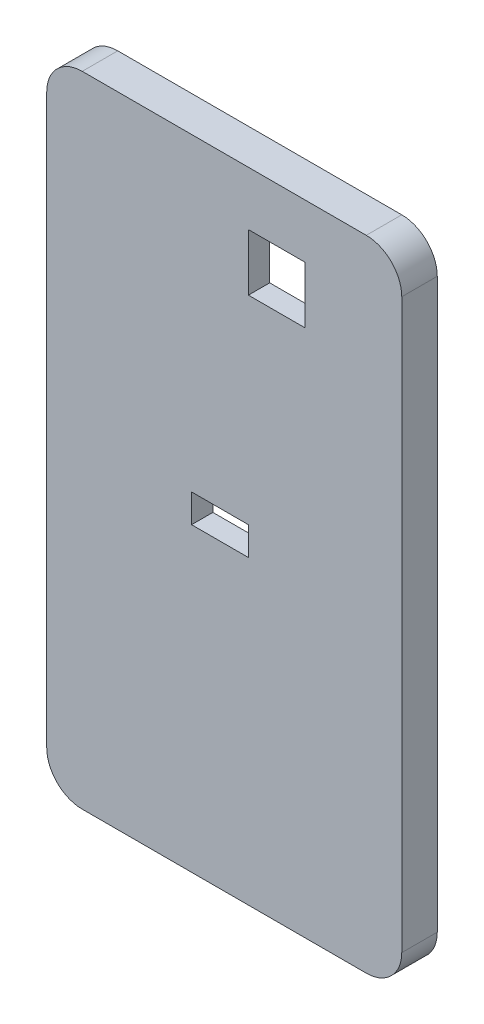
ISO-10303-21;
HEADER;
FILE_DESCRIPTION(('STEP AP214'),'2;1');
FILE_NAME('part.step','',(''),(''),'','','');
FILE_SCHEMA(('AUTOMOTIVE_DESIGN { 1 0 10303 214 1 1 1 1 }'));
ENDSEC;
DATA;
#1=APPLICATION_CONTEXT('core data for automotive mechanical design processes');
#2=APPLICATION_PROTOCOL_DEFINITION('international standard','automotive_design',2000,#1);
#3=PRODUCT_CONTEXT('',#1,'mechanical');
#4=PRODUCT('Part','Part','',(#3));
#5=PRODUCT_RELATED_PRODUCT_CATEGORY('part','',(#4));
#6=PRODUCT_DEFINITION_FORMATION('','',#4);
#7=PRODUCT_DEFINITION_CONTEXT('part definition',#1,'design');
#8=PRODUCT_DEFINITION('design','',#6,#7);
#9=PRODUCT_DEFINITION_SHAPE('','',#8);
#10=(LENGTH_UNIT() NAMED_UNIT(*) SI_UNIT(.MILLI.,.METRE.));
#11=(NAMED_UNIT(*) PLANE_ANGLE_UNIT() SI_UNIT($,.RADIAN.));
#12=(NAMED_UNIT(*) SI_UNIT($,.STERADIAN.) SOLID_ANGLE_UNIT());
#13=UNCERTAINTY_MEASURE_WITH_UNIT(LENGTH_MEASURE(1.E-05),#10,'distance_accuracy_value','');
#14=(GEOMETRIC_REPRESENTATION_CONTEXT(3) GLOBAL_UNCERTAINTY_ASSIGNED_CONTEXT((#13)) GLOBAL_UNIT_ASSIGNED_CONTEXT((#10,
#11,#12)) REPRESENTATION_CONTEXT('',''));
#15=CARTESIAN_POINT('',(0.,0.,0.));
#16=DIRECTION('',(0.,0.,1.));
#17=DIRECTION('',(1.,0.,0.));
#18=AXIS2_PLACEMENT_3D('',#15,#16,#17);
#19=CARTESIAN_POINT('',(0.,0.,6.35));
#20=DIRECTION('',(1.,0.,0.));
#21=DIRECTION('',(0.,1.,0.));
#22=AXIS2_PLACEMENT_3D('',#19,#20,#21);
#23=PLANE('',#22);
#24=DIRECTION('',(0.,-1.,0.));
#25=VECTOR('',#24,1.);
#26=CARTESIAN_POINT('',(0.,0.,6.35));
#27=LINE('',#26,#25);
#28=CARTESIAN_POINT('',(0.,-6.35,6.35));
#29=VERTEX_POINT('',#28);
#30=CARTESIAN_POINT('',(0.,-107.95,6.35));
#31=VERTEX_POINT('',#30);
#32=EDGE_CURVE('E325',#29,#31,#27,.T.);
#33=ORIENTED_EDGE('',*,*,#32,.F.);
#34=DIRECTION('',(0.,0.,-1.));
#35=VECTOR('',#34,1.);
#36=CARTESIAN_POINT('',(0.,-6.35,6.35));
#37=LINE('',#36,#35);
#38=CARTESIAN_POINT('',(0.,-6.35,0.));
#39=VERTEX_POINT('',#38);
#40=EDGE_CURVE('E11',#29,#39,#37,.T.);
#41=ORIENTED_EDGE('',*,*,#40,.T.);
#42=DIRECTION('',(0.,-1.,0.));
#43=VECTOR('',#42,1.);
#44=CARTESIAN_POINT('',(0.,0.,0.));
#45=LINE('',#44,#43);
#46=CARTESIAN_POINT('',(0.,-107.95,0.));
#47=VERTEX_POINT('',#46);
#48=EDGE_CURVE('E310',#39,#47,#45,.T.);
#49=ORIENTED_EDGE('',*,*,#48,.T.);
#50=DIRECTION('',(0.,0.,-1.));
#51=VECTOR('',#50,1.);
#52=CARTESIAN_POINT('',(0.,-107.95,6.35));
#53=LINE('',#52,#51);
#54=EDGE_CURVE('E41',#47,#31,#53,.F.);
#55=ORIENTED_EDGE('',*,*,#54,.T.);
#56=EDGE_LOOP('',(#33,#41,#49,#55));
#57=FACE_BOUND('',#56,.T.);
#58=ADVANCED_FACE('F33',(#57),#23,.F.);
#59=CARTESIAN_POINT('',(0.,-114.3,6.35));
#60=DIRECTION('',(0.,1.,0.));
#61=DIRECTION('',(0.,0.,1.));
#62=AXIS2_PLACEMENT_3D('',#59,#60,#61);
#63=PLANE('',#62);
#64=DIRECTION('',(1.,0.,0.));
#65=VECTOR('',#64,1.);
#66=CARTESIAN_POINT('',(0.,-114.3,0.));
#67=LINE('',#66,#65);
#68=CARTESIAN_POINT('',(6.35000000000001,-114.3,0.));
#69=VERTEX_POINT('',#68);
#70=CARTESIAN_POINT('',(57.15,-114.3,0.));
#71=VERTEX_POINT('',#70);
#72=EDGE_CURVE('E341',#69,#71,#67,.T.);
#73=ORIENTED_EDGE('',*,*,#72,.T.);
#74=DIRECTION('',(0.,0.,-1.));
#75=VECTOR('',#74,1.);
#76=CARTESIAN_POINT('',(57.15,-114.3,6.35));
#77=LINE('',#76,#75);
#78=CARTESIAN_POINT('',(57.15,-114.3,6.35));
#79=VERTEX_POINT('',#78);
#80=EDGE_CURVE('E377',#71,#79,#77,.F.);
#81=ORIENTED_EDGE('',*,*,#80,.T.);
#82=DIRECTION('',(1.,0.,0.));
#83=VECTOR('',#82,1.);
#84=CARTESIAN_POINT('',(0.,-114.3,6.35));
#85=LINE('',#84,#83);
#86=CARTESIAN_POINT('',(6.35000000000001,-114.3,6.35));
#87=VERTEX_POINT('',#86);
#88=EDGE_CURVE('E328',#87,#79,#85,.T.);
#89=ORIENTED_EDGE('',*,*,#88,.F.);
#90=DIRECTION('',(0.,0.,-1.));
#91=VECTOR('',#90,1.);
#92=CARTESIAN_POINT('',(6.35000000000001,-114.3,6.35));
#93=LINE('',#92,#91);
#94=EDGE_CURVE('E374',#87,#69,#93,.T.);
#95=ORIENTED_EDGE('',*,*,#94,.T.);
#96=EDGE_LOOP('',(#73,#81,#89,#95));
#97=FACE_BOUND('',#96,.T.);
#98=ADVANCED_FACE('F391',(#97),#63,.F.);
#99=CARTESIAN_POINT('',(63.5,0.,6.35));
#100=DIRECTION('',(-1.,0.,0.));
#101=DIRECTION('',(0.,-1.,0.));
#102=AXIS2_PLACEMENT_3D('',#99,#100,#101);
#103=PLANE('',#102);
#104=DIRECTION('',(0.,1.,0.));
#105=VECTOR('',#104,1.);
#106=CARTESIAN_POINT('',(63.5,0.,0.));
#107=LINE('',#106,#105);
#108=CARTESIAN_POINT('',(63.5,-107.95,0.));
#109=VERTEX_POINT('',#108);
#110=CARTESIAN_POINT('',(63.5,-6.35,0.));
#111=VERTEX_POINT('',#110);
#112=EDGE_CURVE('E344',#109,#111,#107,.T.);
#113=ORIENTED_EDGE('',*,*,#112,.T.);
#114=DIRECTION('',(0.,0.,-1.));
#115=VECTOR('',#114,1.);
#116=CARTESIAN_POINT('',(63.5,-6.35,6.35));
#117=LINE('',#116,#115);
#118=CARTESIAN_POINT('',(63.5,-6.35,6.35));
#119=VERTEX_POINT('',#118);
#120=EDGE_CURVE('E364',#111,#119,#117,.F.);
#121=ORIENTED_EDGE('',*,*,#120,.T.);
#122=DIRECTION('',(0.,1.,0.));
#123=VECTOR('',#122,1.);
#124=CARTESIAN_POINT('',(63.5,0.,6.35));
#125=LINE('',#124,#123);
#126=CARTESIAN_POINT('',(63.5,-107.95,6.35));
#127=VERTEX_POINT('',#126);
#128=EDGE_CURVE('E332',#127,#119,#125,.T.);
#129=ORIENTED_EDGE('',*,*,#128,.F.);
#130=DIRECTION('',(0.,0.,-1.));
#131=VECTOR('',#130,1.);
#132=CARTESIAN_POINT('',(63.5,-107.95,6.35));
#133=LINE('',#132,#131);
#134=EDGE_CURVE('E361',#127,#109,#133,.T.);
#135=ORIENTED_EDGE('',*,*,#134,.T.);
#136=EDGE_LOOP('',(#113,#121,#129,#135));
#137=FACE_BOUND('',#136,.T.);
#138=ADVANCED_FACE('F403',(#137),#103,.F.);
#139=CARTESIAN_POINT('',(0.,0.,6.35));
#140=DIRECTION('',(0.,-1.,0.));
#141=DIRECTION('',(0.,0.,-1.));
#142=AXIS2_PLACEMENT_3D('',#139,#140,#141);
#143=PLANE('',#142);
#144=DIRECTION('',(-1.,0.,0.));
#145=VECTOR('',#144,1.);
#146=CARTESIAN_POINT('',(0.,0.,6.35));
#147=LINE('',#146,#145);
#148=CARTESIAN_POINT('',(57.15,0.,6.35));
#149=VERTEX_POINT('',#148);
#150=CARTESIAN_POINT('',(6.35,0.,6.35));
#151=VERTEX_POINT('',#150);
#152=EDGE_CURVE('E335',#149,#151,#147,.T.);
#153=ORIENTED_EDGE('',*,*,#152,.F.);
#154=DIRECTION('',(0.,0.,-1.));
#155=VECTOR('',#154,1.);
#156=CARTESIAN_POINT('',(57.15,0.,6.35));
#157=LINE('',#156,#155);
#158=CARTESIAN_POINT('',(57.15,0.,0.));
#159=VERTEX_POINT('',#158);
#160=EDGE_CURVE('E350',#149,#159,#157,.T.);
#161=ORIENTED_EDGE('',*,*,#160,.T.);
#162=DIRECTION('',(-1.,0.,0.));
#163=VECTOR('',#162,1.);
#164=CARTESIAN_POINT('',(0.,0.,0.));
#165=LINE('',#164,#163);
#166=CARTESIAN_POINT('',(6.35,0.,0.));
#167=VERTEX_POINT('',#166);
#168=EDGE_CURVE('E329',#159,#167,#165,.T.);
#169=ORIENTED_EDGE('',*,*,#168,.T.);
#170=DIRECTION('',(0.,0.,-1.));
#171=VECTOR('',#170,1.);
#172=CARTESIAN_POINT('',(6.35,0.,6.35));
#173=LINE('',#172,#171);
#174=EDGE_CURVE('E338',#167,#151,#173,.F.);
#175=ORIENTED_EDGE('',*,*,#174,.T.);
#176=EDGE_LOOP('',(#153,#161,#169,#175));
#177=FACE_BOUND('',#176,.T.);
#178=ADVANCED_FACE('F411',(#177),#143,.F.);
#179=CARTESIAN_POINT('',(0.,0.,6.35));
#180=DIRECTION('',(0.,0.,1.));
#181=DIRECTION('',(1.,0.,0.));
#182=AXIS2_PLACEMENT_3D('',#179,#180,#181);
#183=PLANE('',#182);
#184=DIRECTION('',(-1.,0.,0.));
#185=VECTOR('',#184,1.);
#186=CARTESIAN_POINT('',(0.,-60.452,6.35));
#187=LINE('',#186,#185);
#188=CARTESIAN_POINT('',(36.068,-60.452,6.35));
#189=VERTEX_POINT('',#188);
#190=CARTESIAN_POINT('',(25.908,-60.452,6.35));
#191=VERTEX_POINT('',#190);
#192=EDGE_CURVE('E196',#189,#191,#187,.T.);
#193=ORIENTED_EDGE('',*,*,#192,.T.);
#194=DIRECTION('',(0.,1.,0.));
#195=VECTOR('',#194,1.);
#196=CARTESIAN_POINT('',(25.908,0.,6.35));
#197=LINE('',#196,#195);
#198=CARTESIAN_POINT('',(25.908,-55.372,6.35));
#199=VERTEX_POINT('',#198);
#200=EDGE_CURVE('E202',#191,#199,#197,.T.);
#201=ORIENTED_EDGE('',*,*,#200,.T.);
#202=DIRECTION('',(-1.,0.,0.));
#203=VECTOR('',#202,1.);
#204=CARTESIAN_POINT('',(0.,-55.372,6.35));
#205=LINE('',#204,#203);
#206=CARTESIAN_POINT('',(36.068,-55.372,6.35));
#207=VERTEX_POINT('',#206);
#208=EDGE_CURVE('E206',#207,#199,#205,.T.);
#209=ORIENTED_EDGE('',*,*,#208,.F.);
#210=DIRECTION('',(0.,1.,0.));
#211=VECTOR('',#210,1.);
#212=CARTESIAN_POINT('',(36.068,0.,6.35));
#213=LINE('',#212,#211);
#214=EDGE_CURVE('E199',#189,#207,#213,.T.);
#215=ORIENTED_EDGE('',*,*,#214,.F.);
#216=EDGE_LOOP('',(#193,#201,#209,#215));
#217=FACE_BOUND('',#216,.T.);
#218=DIRECTION('',(0.,-1.,0.));
#219=VECTOR('',#218,1.);
#220=CARTESIAN_POINT('',(46.228,-9.652,6.35));
#221=LINE('',#220,#219);
#222=CARTESIAN_POINT('',(46.228,-9.652,6.35));
#223=VERTEX_POINT('',#222);
#224=CARTESIAN_POINT('',(46.228,-19.812,6.35));
#225=VERTEX_POINT('',#224);
#226=EDGE_CURVE('E229',#223,#225,#221,.T.);
#227=ORIENTED_EDGE('',*,*,#226,.T.);
#228=DIRECTION('',(-1.,0.,0.));
#229=VECTOR('',#228,1.);
#230=CARTESIAN_POINT('',(46.228,-19.812,6.35));
#231=LINE('',#230,#229);
#232=CARTESIAN_POINT('',(36.068,-19.812,6.35));
#233=VERTEX_POINT('',#232);
#234=EDGE_CURVE('E232',#225,#233,#231,.T.);
#235=ORIENTED_EDGE('',*,*,#234,.T.);
#236=DIRECTION('',(0.,1.,0.));
#237=VECTOR('',#236,1.);
#238=CARTESIAN_POINT('',(36.068,-9.652,6.35));
#239=LINE('',#238,#237);
#240=CARTESIAN_POINT('',(36.068,-9.652,6.35));
#241=VERTEX_POINT('',#240);
#242=EDGE_CURVE('E236',#233,#241,#239,.T.);
#243=ORIENTED_EDGE('',*,*,#242,.T.);
#244=DIRECTION('',(1.,0.,0.));
#245=VECTOR('',#244,1.);
#246=CARTESIAN_POINT('',(46.228,-9.652,6.35));
#247=LINE('',#246,#245);
#248=EDGE_CURVE('E239',#241,#223,#247,.T.);
#249=ORIENTED_EDGE('',*,*,#248,.T.);
#250=EDGE_LOOP('',(#227,#235,#243,#249));
#251=FACE_BOUND('',#250,.T.);
#252=ORIENTED_EDGE('',*,*,#128,.T.);
#253=CARTESIAN_POINT('',(57.15,-6.35,6.35));
#254=DIRECTION('',(0.,0.,1.));
#255=DIRECTION('',(1.,0.,0.));
#256=AXIS2_PLACEMENT_3D('',#253,#254,#255);
#257=CIRCLE('',#256,6.35);
#258=EDGE_CURVE('E372',#119,#149,#257,.T.);
#259=ORIENTED_EDGE('',*,*,#258,.T.);
#260=ORIENTED_EDGE('',*,*,#152,.T.);
#261=CARTESIAN_POINT('',(6.35,-6.35,6.35));
#262=DIRECTION('',(0.,0.,1.));
#263=DIRECTION('',(1.,0.,0.));
#264=AXIS2_PLACEMENT_3D('',#261,#262,#263);
#265=CIRCLE('',#264,6.35);
#266=EDGE_CURVE('E368',#151,#29,#265,.T.);
#267=ORIENTED_EDGE('',*,*,#266,.T.);
#268=ORIENTED_EDGE('',*,*,#32,.T.);
#269=CARTESIAN_POINT('',(6.35000000000001,-107.95,6.35));
#270=DIRECTION('',(0.,0.,1.));
#271=DIRECTION('',(1.,0.,0.));
#272=AXIS2_PLACEMENT_3D('',#269,#270,#271);
#273=CIRCLE('',#272,6.35);
#274=EDGE_CURVE('E366',#31,#87,#273,.T.);
#275=ORIENTED_EDGE('',*,*,#274,.T.);
#276=ORIENTED_EDGE('',*,*,#88,.T.);
#277=CARTESIAN_POINT('',(57.15,-107.95,6.35));
#278=DIRECTION('',(0.,0.,1.));
#279=DIRECTION('',(1.,0.,0.));
#280=AXIS2_PLACEMENT_3D('',#277,#278,#279);
#281=CIRCLE('',#280,6.35);
#282=EDGE_CURVE('E370',#79,#127,#281,.T.);
#283=ORIENTED_EDGE('',*,*,#282,.T.);
#284=EDGE_LOOP('',(#252,#259,#260,#267,#268,#275,#276,#283));
#285=FACE_BOUND('',#284,.T.);
#286=ADVANCED_FACE('F208',(#217,#251,#285),#183,.T.);
#287=CARTESIAN_POINT('',(0.,0.,0.));
#288=DIRECTION('',(0.,0.,1.));
#289=DIRECTION('',(1.,0.,0.));
#290=AXIS2_PLACEMENT_3D('',#287,#288,#289);
#291=PLANE('',#290);
#292=DIRECTION('',(0.,-1.,0.));
#293=VECTOR('',#292,1.);
#294=CARTESIAN_POINT('',(60.96,-6.45365241608726,0.));
#295=LINE('',#294,#293);
#296=CARTESIAN_POINT('',(60.96,-6.45365241608726,0.));
#297=VERTEX_POINT('',#296);
#298=CARTESIAN_POINT('',(60.96,-107.95,0.));
#299=VERTEX_POINT('',#298);
#300=EDGE_CURVE('E288',#297,#299,#295,.T.);
#301=ORIENTED_EDGE('',*,*,#300,.F.);
#302=CARTESIAN_POINT('',(57.151410218659,-6.34999973901355,0.));
#303=DIRECTION('',(0.,0.,-1.));
#304=DIRECTION('',(1.,0.,0.));
#305=AXIS2_PLACEMENT_3D('',#302,#303,#304);
#306=CIRCLE('',#305,3.81);
#307=CARTESIAN_POINT('',(57.15,-2.54,0.));
#308=VERTEX_POINT('',#307);
#309=EDGE_CURVE('E254',#308,#297,#306,.T.);
#310=ORIENTED_EDGE('',*,*,#309,.F.);
#311=DIRECTION('',(1.,0.,0.));
#312=VECTOR('',#311,1.);
#313=CARTESIAN_POINT('',(57.15,-2.54,0.));
#314=LINE('',#313,#312);
#315=CARTESIAN_POINT('',(6.35,-2.54,0.));
#316=VERTEX_POINT('',#315);
#317=EDGE_CURVE('E265',#316,#308,#314,.T.);
#318=ORIENTED_EDGE('',*,*,#317,.F.);
#319=CARTESIAN_POINT('',(6.34999999999942,-6.34999999999942,0.));
#320=DIRECTION('',(0.,0.,-1.));
#321=DIRECTION('',(1.,0.,0.));
#322=AXIS2_PLACEMENT_3D('',#319,#320,#321);
#323=CIRCLE('',#322,3.80999999999941);
#324=CARTESIAN_POINT('',(2.54,-6.35,0.));
#325=VERTEX_POINT('',#324);
#326=EDGE_CURVE('E303',#325,#316,#323,.T.);
#327=ORIENTED_EDGE('',*,*,#326,.F.);
#328=DIRECTION('',(0.,1.,0.));
#329=VECTOR('',#328,1.);
#330=CARTESIAN_POINT('',(2.54,-6.35,0.));
#331=LINE('',#330,#329);
#332=CARTESIAN_POINT('',(2.53999999999999,-107.95,0.));
#333=VERTEX_POINT('',#332);
#334=EDGE_CURVE('E300',#333,#325,#331,.T.);
#335=ORIENTED_EDGE('',*,*,#334,.F.);
#336=CARTESIAN_POINT('',(6.35000000000006,-107.95,0.));
#337=DIRECTION('',(0.,0.,-1.));
#338=DIRECTION('',(1.,0.,0.));
#339=AXIS2_PLACEMENT_3D('',#336,#337,#338);
#340=CIRCLE('',#339,3.81000000000007);
#341=CARTESIAN_POINT('',(6.35,-111.76,0.));
#342=VERTEX_POINT('',#341);
#343=EDGE_CURVE('E297',#342,#333,#340,.T.);
#344=ORIENTED_EDGE('',*,*,#343,.F.);
#345=DIRECTION('',(-1.,0.,0.));
#346=VECTOR('',#345,1.);
#347=CARTESIAN_POINT('',(6.35,-111.76,0.));
#348=LINE('',#347,#346);
#349=CARTESIAN_POINT('',(57.15,-111.76,0.));
#350=VERTEX_POINT('',#349);
#351=EDGE_CURVE('E294',#350,#342,#348,.T.);
#352=ORIENTED_EDGE('',*,*,#351,.F.);
#353=CARTESIAN_POINT('',(57.1500000000001,-107.95,0.));
#354=DIRECTION('',(0.,0.,-1.));
#355=DIRECTION('',(1.,0.,0.));
#356=AXIS2_PLACEMENT_3D('',#353,#354,#355);
#357=CIRCLE('',#356,3.80999999999991);
#358=EDGE_CURVE('E291',#299,#350,#357,.T.);
#359=ORIENTED_EDGE('',*,*,#358,.F.);
#360=EDGE_LOOP('',(#301,#310,#318,#327,#335,#344,#352,#359));
#361=FACE_BOUND('',#360,.T.);
#362=ORIENTED_EDGE('',*,*,#168,.F.);
#363=CARTESIAN_POINT('',(57.15,-6.35,0.));
#364=DIRECTION('',(0.,0.,1.));
#365=DIRECTION('',(1.,0.,0.));
#366=AXIS2_PLACEMENT_3D('',#363,#364,#365);
#367=CIRCLE('',#366,6.35);
#368=EDGE_CURVE('E359',#159,#111,#367,.F.);
#369=ORIENTED_EDGE('',*,*,#368,.T.);
#370=ORIENTED_EDGE('',*,*,#112,.F.);
#371=CARTESIAN_POINT('',(57.15,-107.95,0.));
#372=DIRECTION('',(0.,0.,1.));
#373=DIRECTION('',(1.,0.,0.));
#374=AXIS2_PLACEMENT_3D('',#371,#372,#373);
#375=CIRCLE('',#374,6.35);
#376=EDGE_CURVE('E357',#109,#71,#375,.F.);
#377=ORIENTED_EDGE('',*,*,#376,.T.);
#378=ORIENTED_EDGE('',*,*,#72,.F.);
#379=CARTESIAN_POINT('',(6.35000000000001,-107.95,0.));
#380=DIRECTION('',(0.,0.,1.));
#381=DIRECTION('',(1.,0.,0.));
#382=AXIS2_PLACEMENT_3D('',#379,#380,#381);
#383=CIRCLE('',#382,6.35);
#384=EDGE_CURVE('E353',#69,#47,#383,.F.);
#385=ORIENTED_EDGE('',*,*,#384,.T.);
#386=ORIENTED_EDGE('',*,*,#48,.F.);
#387=CARTESIAN_POINT('',(6.35,-6.35,0.));
#388=DIRECTION('',(0.,0.,1.));
#389=DIRECTION('',(1.,0.,0.));
#390=AXIS2_PLACEMENT_3D('',#387,#388,#389);
#391=CIRCLE('',#390,6.35);
#392=EDGE_CURVE('E355',#39,#167,#391,.F.);
#393=ORIENTED_EDGE('',*,*,#392,.T.);
#394=EDGE_LOOP('',(#362,#369,#370,#377,#378,#385,#386,#393));
#395=FACE_BOUND('',#394,.T.);
#396=ADVANCED_FACE('F395',(#361,#395),#291,.F.);
#397=CARTESIAN_POINT('',(57.15,-6.35,6.35));
#398=DIRECTION('',(0.,0.,-1.));
#399=DIRECTION('',(-1.,0.,0.));
#400=AXIS2_PLACEMENT_3D('',#397,#398,#399);
#401=CYLINDRICAL_SURFACE('',#400,6.35);
#402=ORIENTED_EDGE('',*,*,#258,.F.);
#403=ORIENTED_EDGE('',*,*,#120,.F.);
#404=ORIENTED_EDGE('',*,*,#368,.F.);
#405=ORIENTED_EDGE('',*,*,#160,.F.);
#406=EDGE_LOOP('',(#402,#403,#404,#405));
#407=FACE_BOUND('',#406,.T.);
#408=ADVANCED_FACE('F409',(#407),#401,.T.);
#409=CARTESIAN_POINT('',(57.15,-107.95,6.35));
#410=DIRECTION('',(0.,0.,-1.));
#411=DIRECTION('',(-1.,0.,0.));
#412=AXIS2_PLACEMENT_3D('',#409,#410,#411);
#413=CYLINDRICAL_SURFACE('',#412,6.35);
#414=ORIENTED_EDGE('',*,*,#282,.F.);
#415=ORIENTED_EDGE('',*,*,#80,.F.);
#416=ORIENTED_EDGE('',*,*,#376,.F.);
#417=ORIENTED_EDGE('',*,*,#134,.F.);
#418=EDGE_LOOP('',(#414,#415,#416,#417));
#419=FACE_BOUND('',#418,.T.);
#420=ADVANCED_FACE('F400',(#419),#413,.T.);
#421=CARTESIAN_POINT('',(6.35,-6.35,6.35));
#422=DIRECTION('',(0.,0.,-1.));
#423=DIRECTION('',(-1.,0.,0.));
#424=AXIS2_PLACEMENT_3D('',#421,#422,#423);
#425=CYLINDRICAL_SURFACE('',#424,6.35);
#426=ORIENTED_EDGE('',*,*,#266,.F.);
#427=ORIENTED_EDGE('',*,*,#174,.F.);
#428=ORIENTED_EDGE('',*,*,#392,.F.);
#429=ORIENTED_EDGE('',*,*,#40,.F.);
#430=EDGE_LOOP('',(#426,#427,#428,#429));
#431=FACE_BOUND('',#430,.T.);
#432=ADVANCED_FACE('F414',(#431),#425,.T.);
#433=CARTESIAN_POINT('',(6.35000000000001,-107.95,6.35));
#434=DIRECTION('',(0.,0.,-1.));
#435=DIRECTION('',(-1.,0.,0.));
#436=AXIS2_PLACEMENT_3D('',#433,#434,#435);
#437=CYLINDRICAL_SURFACE('',#436,6.35);
#438=ORIENTED_EDGE('',*,*,#274,.F.);
#439=ORIENTED_EDGE('',*,*,#54,.F.);
#440=ORIENTED_EDGE('',*,*,#384,.F.);
#441=ORIENTED_EDGE('',*,*,#94,.F.);
#442=EDGE_LOOP('',(#438,#439,#440,#441));
#443=FACE_BOUND('',#442,.T.);
#444=ADVANCED_FACE('F35',(#443),#437,.T.);
#445=CARTESIAN_POINT('',(57.151410218659,-6.34999973901355,2.54));
#446=DIRECTION('',(0.,0.,-1.));
#447=DIRECTION('',(-1.,0.,0.));
#448=AXIS2_PLACEMENT_3D('',#445,#446,#447);
#449=CYLINDRICAL_SURFACE('',#448,3.81);
#450=ORIENTED_EDGE('',*,*,#309,.T.);
#451=DIRECTION('',(0.,0.,-1.));
#452=VECTOR('',#451,1.);
#453=CARTESIAN_POINT('',(60.96,-6.45365241608726,2.54));
#454=LINE('',#453,#452);
#455=CARTESIAN_POINT('',(60.96,-6.45365241608726,2.54));
#456=VERTEX_POINT('',#455);
#457=EDGE_CURVE('E286',#456,#297,#454,.T.);
#458=ORIENTED_EDGE('',*,*,#457,.F.);
#459=CARTESIAN_POINT('',(57.151410218659,-6.34999973901355,2.54));
#460=DIRECTION('',(0.,0.,-1.));
#461=DIRECTION('',(1.,0.,0.));
#462=AXIS2_PLACEMENT_3D('',#459,#460,#461);
#463=CIRCLE('',#462,3.81);
#464=CARTESIAN_POINT('',(57.15,-2.54,2.54));
#465=VERTEX_POINT('',#464);
#466=EDGE_CURVE('E261',#465,#456,#463,.T.);
#467=ORIENTED_EDGE('',*,*,#466,.F.);
#468=DIRECTION('',(0.,0.,-1.));
#469=VECTOR('',#468,1.);
#470=CARTESIAN_POINT('',(57.15,-2.54,2.54));
#471=LINE('',#470,#469);
#472=EDGE_CURVE('E308',#465,#308,#471,.T.);
#473=ORIENTED_EDGE('',*,*,#472,.T.);
#474=EDGE_LOOP('',(#450,#458,#467,#473));
#475=FACE_BOUND('',#474,.T.);
#476=ADVANCED_FACE('F420',(#475),#449,.F.);
#477=CARTESIAN_POINT('',(57.15,-2.54,2.54));
#478=DIRECTION('',(0.,1.,0.));
#479=DIRECTION('',(0.,0.,1.));
#480=AXIS2_PLACEMENT_3D('',#477,#478,#479);
#481=PLANE('',#480);
#482=ORIENTED_EDGE('',*,*,#317,.T.);
#483=ORIENTED_EDGE('',*,*,#472,.F.);
#484=DIRECTION('',(1.,0.,0.));
#485=VECTOR('',#484,1.);
#486=CARTESIAN_POINT('',(57.15,-2.54,2.54));
#487=LINE('',#486,#485);
#488=CARTESIAN_POINT('',(6.35,-2.54,2.54));
#489=VERTEX_POINT('',#488);
#490=EDGE_CURVE('E283',#489,#465,#487,.T.);
#491=ORIENTED_EDGE('',*,*,#490,.F.);
#492=DIRECTION('',(0.,0.,-1.));
#493=VECTOR('',#492,1.);
#494=CARTESIAN_POINT('',(6.35,-2.54,2.54));
#495=LINE('',#494,#493);
#496=EDGE_CURVE('E311',#489,#316,#495,.T.);
#497=ORIENTED_EDGE('',*,*,#496,.T.);
#498=EDGE_LOOP('',(#482,#483,#491,#497));
#499=FACE_BOUND('',#498,.T.);
#500=ADVANCED_FACE('F533',(#499),#481,.F.);
#501=CARTESIAN_POINT('',(6.34999999999942,-6.34999999999942,2.54));
#502=DIRECTION('',(0.,0.,-1.));
#503=DIRECTION('',(-1.,0.,0.));
#504=AXIS2_PLACEMENT_3D('',#501,#502,#503);
#505=CYLINDRICAL_SURFACE('',#504,3.80999999999941);
#506=ORIENTED_EDGE('',*,*,#326,.T.);
#507=ORIENTED_EDGE('',*,*,#496,.F.);
#508=CARTESIAN_POINT('',(6.34999999999942,-6.34999999999942,2.54));
#509=DIRECTION('',(0.,0.,-1.));
#510=DIRECTION('',(1.,0.,0.));
#511=AXIS2_PLACEMENT_3D('',#508,#509,#510);
#512=CIRCLE('',#511,3.80999999999941);
#513=CARTESIAN_POINT('',(2.54,-6.35,2.54));
#514=VERTEX_POINT('',#513);
#515=EDGE_CURVE('E280',#514,#489,#512,.T.);
#516=ORIENTED_EDGE('',*,*,#515,.F.);
#517=DIRECTION('',(0.,0.,-1.));
#518=VECTOR('',#517,1.);
#519=CARTESIAN_POINT('',(2.54,-6.35,2.54));
#520=LINE('',#519,#518);
#521=EDGE_CURVE('E313',#514,#325,#520,.T.);
#522=ORIENTED_EDGE('',*,*,#521,.T.);
#523=EDGE_LOOP('',(#506,#507,#516,#522));
#524=FACE_BOUND('',#523,.T.);
#525=ADVANCED_FACE('F536',(#524),#505,.F.);
#526=CARTESIAN_POINT('',(2.54,-6.35,2.54));
#527=DIRECTION('',(-1.,0.,0.));
#528=DIRECTION('',(0.,-1.,0.));
#529=AXIS2_PLACEMENT_3D('',#526,#527,#528);
#530=PLANE('',#529);
#531=ORIENTED_EDGE('',*,*,#334,.T.);
#532=ORIENTED_EDGE('',*,*,#521,.F.);
#533=DIRECTION('',(0.,1.,0.));
#534=VECTOR('',#533,1.);
#535=CARTESIAN_POINT('',(2.54,-6.35,2.54));
#536=LINE('',#535,#534);
#537=CARTESIAN_POINT('',(2.53999999999999,-107.95,2.54));
#538=VERTEX_POINT('',#537);
#539=EDGE_CURVE('E277',#538,#514,#536,.T.);
#540=ORIENTED_EDGE('',*,*,#539,.F.);
#541=DIRECTION('',(0.,0.,-1.));
#542=VECTOR('',#541,1.);
#543=CARTESIAN_POINT('',(2.53999999999999,-107.95,2.54));
#544=LINE('',#543,#542);
#545=EDGE_CURVE('E315',#538,#333,#544,.T.);
#546=ORIENTED_EDGE('',*,*,#545,.T.);
#547=EDGE_LOOP('',(#531,#532,#540,#546));
#548=FACE_BOUND('',#547,.T.);
#549=ADVANCED_FACE('F540',(#548),#530,.F.);
#550=CARTESIAN_POINT('',(6.35000000000006,-107.95,2.54));
#551=DIRECTION('',(0.,0.,-1.));
#552=DIRECTION('',(-1.,0.,0.));
#553=AXIS2_PLACEMENT_3D('',#550,#551,#552);
#554=CYLINDRICAL_SURFACE('',#553,3.81000000000007);
#555=ORIENTED_EDGE('',*,*,#343,.T.);
#556=ORIENTED_EDGE('',*,*,#545,.F.);
#557=CARTESIAN_POINT('',(6.35000000000006,-107.95,2.54));
#558=DIRECTION('',(0.,0.,-1.));
#559=DIRECTION('',(1.,0.,0.));
#560=AXIS2_PLACEMENT_3D('',#557,#558,#559);
#561=CIRCLE('',#560,3.81000000000007);
#562=CARTESIAN_POINT('',(6.35,-111.76,2.54));
#563=VERTEX_POINT('',#562);
#564=EDGE_CURVE('E274',#563,#538,#561,.T.);
#565=ORIENTED_EDGE('',*,*,#564,.F.);
#566=DIRECTION('',(0.,0.,-1.));
#567=VECTOR('',#566,1.);
#568=CARTESIAN_POINT('',(6.35,-111.76,2.54));
#569=LINE('',#568,#567);
#570=EDGE_CURVE('E317',#563,#342,#569,.T.);
#571=ORIENTED_EDGE('',*,*,#570,.T.);
#572=EDGE_LOOP('',(#555,#556,#565,#571));
#573=FACE_BOUND('',#572,.T.);
#574=ADVANCED_FACE('F544',(#573),#554,.F.);
#575=CARTESIAN_POINT('',(6.35,-111.76,2.54));
#576=DIRECTION('',(0.,-1.,0.));
#577=DIRECTION('',(1.,0.,0.));
#578=AXIS2_PLACEMENT_3D('',#575,#576,#577);
#579=PLANE('',#578);
#580=ORIENTED_EDGE('',*,*,#351,.T.);
#581=ORIENTED_EDGE('',*,*,#570,.F.);
#582=DIRECTION('',(-1.,0.,0.));
#583=VECTOR('',#582,1.);
#584=CARTESIAN_POINT('',(6.35,-111.76,2.54));
#585=LINE('',#584,#583);
#586=CARTESIAN_POINT('',(57.15,-111.76,2.54));
#587=VERTEX_POINT('',#586);
#588=EDGE_CURVE('E271',#587,#563,#585,.T.);
#589=ORIENTED_EDGE('',*,*,#588,.F.);
#590=DIRECTION('',(0.,0.,-1.));
#591=VECTOR('',#590,1.);
#592=CARTESIAN_POINT('',(57.15,-111.76,2.54));
#593=LINE('',#592,#591);
#594=EDGE_CURVE('E319',#587,#350,#593,.T.);
#595=ORIENTED_EDGE('',*,*,#594,.T.);
#596=EDGE_LOOP('',(#580,#581,#589,#595));
#597=FACE_BOUND('',#596,.T.);
#598=ADVANCED_FACE('F548',(#597),#579,.F.);
#599=CARTESIAN_POINT('',(57.1500000000001,-107.95,2.54));
#600=DIRECTION('',(0.,0.,-1.));
#601=DIRECTION('',(-1.,0.,0.));
#602=AXIS2_PLACEMENT_3D('',#599,#600,#601);
#603=CYLINDRICAL_SURFACE('',#602,3.80999999999991);
#604=ORIENTED_EDGE('',*,*,#358,.T.);
#605=ORIENTED_EDGE('',*,*,#594,.F.);
#606=CARTESIAN_POINT('',(57.1500000000001,-107.95,2.54));
#607=DIRECTION('',(0.,0.,-1.));
#608=DIRECTION('',(1.,0.,0.));
#609=AXIS2_PLACEMENT_3D('',#606,#607,#608);
#610=CIRCLE('',#609,3.80999999999991);
#611=CARTESIAN_POINT('',(60.96,-107.95,2.54));
#612=VERTEX_POINT('',#611);
#613=EDGE_CURVE('E268',#612,#587,#610,.T.);
#614=ORIENTED_EDGE('',*,*,#613,.F.);
#615=DIRECTION('',(0.,0.,-1.));
#616=VECTOR('',#615,1.);
#617=CARTESIAN_POINT('',(60.96,-107.95,2.54));
#618=LINE('',#617,#616);
#619=EDGE_CURVE('E321',#612,#299,#618,.T.);
#620=ORIENTED_EDGE('',*,*,#619,.T.);
#621=EDGE_LOOP('',(#604,#605,#614,#620));
#622=FACE_BOUND('',#621,.T.);
#623=ADVANCED_FACE('F552',(#622),#603,.F.);
#624=CARTESIAN_POINT('',(60.96,-6.45365241608726,2.54));
#625=DIRECTION('',(1.,0.,0.));
#626=DIRECTION('',(0.,1.,0.));
#627=AXIS2_PLACEMENT_3D('',#624,#625,#626);
#628=PLANE('',#627);
#629=ORIENTED_EDGE('',*,*,#300,.T.);
#630=ORIENTED_EDGE('',*,*,#619,.F.);
#631=DIRECTION('',(0.,-1.,0.));
#632=VECTOR('',#631,1.);
#633=CARTESIAN_POINT('',(60.96,-6.45365241608726,2.54));
#634=LINE('',#633,#632);
#635=EDGE_CURVE('E264',#456,#612,#634,.T.);
#636=ORIENTED_EDGE('',*,*,#635,.F.);
#637=ORIENTED_EDGE('',*,*,#457,.T.);
#638=EDGE_LOOP('',(#629,#630,#636,#637));
#639=FACE_BOUND('',#638,.T.);
#640=ADVANCED_FACE('F475',(#639),#628,.F.);
#641=CARTESIAN_POINT('',(57.151410218659,-6.34999973901355,2.54));
#642=DIRECTION('',(0.,0.,1.));
#643=DIRECTION('',(1.,0.,0.));
#644=AXIS2_PLACEMENT_3D('',#641,#642,#643);
#645=PLANE('',#644);
#646=DIRECTION('',(0.,1.,0.));
#647=VECTOR('',#646,1.);
#648=CARTESIAN_POINT('',(25.908,0.,2.54));
#649=LINE('',#648,#647);
#650=CARTESIAN_POINT('',(25.908,-60.452,2.54));
#651=VERTEX_POINT('',#650);
#652=CARTESIAN_POINT('',(25.908,-55.372,2.54));
#653=VERTEX_POINT('',#652);
#654=EDGE_CURVE('E219',#651,#653,#649,.T.);
#655=ORIENTED_EDGE('',*,*,#654,.F.);
#656=DIRECTION('',(-1.,0.,0.));
#657=VECTOR('',#656,1.);
#658=CARTESIAN_POINT('',(0.,-60.452,2.54));
#659=LINE('',#658,#657);
#660=CARTESIAN_POINT('',(36.068,-60.452,2.54));
#661=VERTEX_POINT('',#660);
#662=EDGE_CURVE('E56',#661,#651,#659,.T.);
#663=ORIENTED_EDGE('',*,*,#662,.F.);
#664=DIRECTION('',(0.,1.,0.));
#665=VECTOR('',#664,1.);
#666=CARTESIAN_POINT('',(36.068,0.,2.54));
#667=LINE('',#666,#665);
#668=CARTESIAN_POINT('',(36.068,-55.372,2.54));
#669=VERTEX_POINT('',#668);
#670=EDGE_CURVE('E210',#661,#669,#667,.T.);
#671=ORIENTED_EDGE('',*,*,#670,.T.);
#672=DIRECTION('',(-1.,0.,0.));
#673=VECTOR('',#672,1.);
#674=CARTESIAN_POINT('',(0.,-55.372,2.54));
#675=LINE('',#674,#673);
#676=EDGE_CURVE('E213',#669,#653,#675,.T.);
#677=ORIENTED_EDGE('',*,*,#676,.T.);
#678=EDGE_LOOP('',(#655,#663,#671,#677));
#679=FACE_BOUND('',#678,.T.);
#680=DIRECTION('',(-1.,0.,0.));
#681=VECTOR('',#680,1.);
#682=CARTESIAN_POINT('',(46.228,-19.812,2.54));
#683=LINE('',#682,#681);
#684=CARTESIAN_POINT('',(46.228,-19.812,2.54));
#685=VERTEX_POINT('',#684);
#686=CARTESIAN_POINT('',(36.068,-19.812,2.54));
#687=VERTEX_POINT('',#686);
#688=EDGE_CURVE('E244',#685,#687,#683,.T.);
#689=ORIENTED_EDGE('',*,*,#688,.F.);
#690=DIRECTION('',(0.,-1.,0.));
#691=VECTOR('',#690,1.);
#692=CARTESIAN_POINT('',(46.228,-9.652,2.54));
#693=LINE('',#692,#691);
#694=CARTESIAN_POINT('',(46.228,-9.652,2.54));
#695=VERTEX_POINT('',#694);
#696=EDGE_CURVE('E225',#695,#685,#693,.T.);
#697=ORIENTED_EDGE('',*,*,#696,.F.);
#698=DIRECTION('',(1.,0.,0.));
#699=VECTOR('',#698,1.);
#700=CARTESIAN_POINT('',(46.228,-9.652,2.54));
#701=LINE('',#700,#699);
#702=CARTESIAN_POINT('',(36.068,-9.652,2.54));
#703=VERTEX_POINT('',#702);
#704=EDGE_CURVE('E233',#703,#695,#701,.T.);
#705=ORIENTED_EDGE('',*,*,#704,.F.);
#706=DIRECTION('',(0.,1.,0.));
#707=VECTOR('',#706,1.);
#708=CARTESIAN_POINT('',(36.068,-9.652,2.54));
#709=LINE('',#708,#707);
#710=EDGE_CURVE('E247',#687,#703,#709,.T.);
#711=ORIENTED_EDGE('',*,*,#710,.F.);
#712=EDGE_LOOP('',(#689,#697,#705,#711));
#713=FACE_BOUND('',#712,.T.);
#714=ORIENTED_EDGE('',*,*,#466,.T.);
#715=ORIENTED_EDGE('',*,*,#635,.T.);
#716=ORIENTED_EDGE('',*,*,#613,.T.);
#717=ORIENTED_EDGE('',*,*,#588,.T.);
#718=ORIENTED_EDGE('',*,*,#564,.T.);
#719=ORIENTED_EDGE('',*,*,#539,.T.);
#720=ORIENTED_EDGE('',*,*,#515,.T.);
#721=ORIENTED_EDGE('',*,*,#490,.T.);
#722=EDGE_LOOP('',(#714,#715,#716,#717,#718,#719,#720,#721));
#723=FACE_BOUND('',#722,.T.);
#724=ADVANCED_FACE('F469',(#679,#713,#723),#645,.F.);
#725=CARTESIAN_POINT('',(46.228,-9.652,6.35));
#726=DIRECTION('',(1.,0.,0.));
#727=DIRECTION('',(0.,0.,-1.));
#728=AXIS2_PLACEMENT_3D('',#725,#726,#727);
#729=PLANE('',#728);
#730=ORIENTED_EDGE('',*,*,#696,.T.);
#731=DIRECTION('',(0.,0.,-1.));
#732=VECTOR('',#731,1.);
#733=CARTESIAN_POINT('',(46.228,-19.812,6.35));
#734=LINE('',#733,#732);
#735=EDGE_CURVE('E242',#225,#685,#734,.T.);
#736=ORIENTED_EDGE('',*,*,#735,.F.);
#737=ORIENTED_EDGE('',*,*,#226,.F.);
#738=DIRECTION('',(0.,0.,-1.));
#739=VECTOR('',#738,1.);
#740=CARTESIAN_POINT('',(46.228,-9.652,6.35));
#741=LINE('',#740,#739);
#742=EDGE_CURVE('E252',#223,#695,#741,.T.);
#743=ORIENTED_EDGE('',*,*,#742,.T.);
#744=EDGE_LOOP('',(#730,#736,#737,#743));
#745=FACE_BOUND('',#744,.T.);
#746=ADVANCED_FACE('F474',(#745),#729,.F.);
#747=CARTESIAN_POINT('',(46.228,-9.652,6.35));
#748=DIRECTION('',(0.,1.,0.));
#749=DIRECTION('',(0.,0.,1.));
#750=AXIS2_PLACEMENT_3D('',#747,#748,#749);
#751=PLANE('',#750);
#752=ORIENTED_EDGE('',*,*,#704,.T.);
#753=ORIENTED_EDGE('',*,*,#742,.F.);
#754=ORIENTED_EDGE('',*,*,#248,.F.);
#755=DIRECTION('',(0.,0.,-1.));
#756=VECTOR('',#755,1.);
#757=CARTESIAN_POINT('',(36.068,-9.652,6.35));
#758=LINE('',#757,#756);
#759=EDGE_CURVE('E255',#241,#703,#758,.T.);
#760=ORIENTED_EDGE('',*,*,#759,.T.);
#761=EDGE_LOOP('',(#752,#753,#754,#760));
#762=FACE_BOUND('',#761,.T.);
#763=ADVANCED_FACE('F521',(#762),#751,.F.);
#764=CARTESIAN_POINT('',(36.068,-9.652,6.35));
#765=DIRECTION('',(-1.,0.,0.));
#766=DIRECTION('',(0.,-1.,0.));
#767=AXIS2_PLACEMENT_3D('',#764,#765,#766);
#768=PLANE('',#767);
#769=ORIENTED_EDGE('',*,*,#710,.T.);
#770=ORIENTED_EDGE('',*,*,#759,.F.);
#771=ORIENTED_EDGE('',*,*,#242,.F.);
#772=DIRECTION('',(0.,0.,-1.));
#773=VECTOR('',#772,1.);
#774=CARTESIAN_POINT('',(36.068,-19.812,6.35));
#775=LINE('',#774,#773);
#776=EDGE_CURVE('E257',#233,#687,#775,.T.);
#777=ORIENTED_EDGE('',*,*,#776,.T.);
#778=EDGE_LOOP('',(#769,#770,#771,#777));
#779=FACE_BOUND('',#778,.T.);
#780=ADVANCED_FACE('F524',(#779),#768,.F.);
#781=CARTESIAN_POINT('',(46.228,-19.812,6.35));
#782=DIRECTION('',(0.,-1.,0.));
#783=DIRECTION('',(0.,0.,-1.));
#784=AXIS2_PLACEMENT_3D('',#781,#782,#783);
#785=PLANE('',#784);
#786=ORIENTED_EDGE('',*,*,#688,.T.);
#787=ORIENTED_EDGE('',*,*,#776,.F.);
#788=ORIENTED_EDGE('',*,*,#234,.F.);
#789=ORIENTED_EDGE('',*,*,#735,.T.);
#790=EDGE_LOOP('',(#786,#787,#788,#789));
#791=FACE_BOUND('',#790,.T.);
#792=ADVANCED_FACE('F464',(#791),#785,.F.);
#793=CARTESIAN_POINT('',(0.,-60.452,6.35));
#794=DIRECTION('',(0.,-1.,0.));
#795=DIRECTION('',(0.,0.,-1.));
#796=AXIS2_PLACEMENT_3D('',#793,#794,#795);
#797=PLANE('',#796);
#798=ORIENTED_EDGE('',*,*,#662,.T.);
#799=DIRECTION('',(0.,0.,-1.));
#800=VECTOR('',#799,1.);
#801=CARTESIAN_POINT('',(25.908,-60.452,6.35));
#802=LINE('',#801,#800);
#803=EDGE_CURVE('E193',#191,#651,#802,.T.);
#804=ORIENTED_EDGE('',*,*,#803,.F.);
#805=ORIENTED_EDGE('',*,*,#192,.F.);
#806=DIRECTION('',(0.,0.,-1.));
#807=VECTOR('',#806,1.);
#808=CARTESIAN_POINT('',(36.068,-60.452,6.35));
#809=LINE('',#808,#807);
#810=EDGE_CURVE('E223',#189,#661,#809,.T.);
#811=ORIENTED_EDGE('',*,*,#810,.T.);
#812=EDGE_LOOP('',(#798,#804,#805,#811));
#813=FACE_BOUND('',#812,.T.);
#814=ADVANCED_FACE('F194',(#813),#797,.F.);
#815=CARTESIAN_POINT('',(36.068,0.,6.35));
#816=DIRECTION('',(-1.,0.,0.));
#817=DIRECTION('',(0.,0.,1.));
#818=AXIS2_PLACEMENT_3D('',#815,#816,#817);
#819=PLANE('',#818);
#820=ORIENTED_EDGE('',*,*,#670,.F.);
#821=ORIENTED_EDGE('',*,*,#810,.F.);
#822=ORIENTED_EDGE('',*,*,#214,.T.);
#823=DIRECTION('',(0.,0.,-1.));
#824=VECTOR('',#823,1.);
#825=CARTESIAN_POINT('',(36.068,-55.372,6.35));
#826=LINE('',#825,#824);
#827=EDGE_CURVE('E226',#207,#669,#826,.T.);
#828=ORIENTED_EDGE('',*,*,#827,.T.);
#829=EDGE_LOOP('',(#820,#821,#822,#828));
#830=FACE_BOUND('',#829,.T.);
#831=ADVANCED_FACE('F489',(#830),#819,.T.);
#832=CARTESIAN_POINT('',(0.,-55.372,6.35));
#833=DIRECTION('',(0.,-1.,0.));
#834=DIRECTION('',(0.,0.,-1.));
#835=AXIS2_PLACEMENT_3D('',#832,#833,#834);
#836=PLANE('',#835);
#837=ORIENTED_EDGE('',*,*,#676,.F.);
#838=ORIENTED_EDGE('',*,*,#827,.F.);
#839=ORIENTED_EDGE('',*,*,#208,.T.);
#840=DIRECTION('',(0.,0.,-1.));
#841=VECTOR('',#840,1.);
#842=CARTESIAN_POINT('',(25.908,-55.372,6.35));
#843=LINE('',#842,#841);
#844=EDGE_CURVE('E48',#199,#653,#843,.T.);
#845=ORIENTED_EDGE('',*,*,#844,.T.);
#846=EDGE_LOOP('',(#837,#838,#839,#845));
#847=FACE_BOUND('',#846,.T.);
#848=ADVANCED_FACE('F498',(#847),#836,.T.);
#849=CARTESIAN_POINT('',(25.908,0.,6.35));
#850=DIRECTION('',(-1.,0.,0.));
#851=DIRECTION('',(0.,0.,1.));
#852=AXIS2_PLACEMENT_3D('',#849,#850,#851);
#853=PLANE('',#852);
#854=ORIENTED_EDGE('',*,*,#654,.T.);
#855=ORIENTED_EDGE('',*,*,#844,.F.);
#856=ORIENTED_EDGE('',*,*,#200,.F.);
#857=ORIENTED_EDGE('',*,*,#803,.T.);
#858=EDGE_LOOP('',(#854,#855,#856,#857));
#859=FACE_BOUND('',#858,.T.);
#860=ADVANCED_FACE('F203',(#859),#853,.F.);
#861=CLOSED_SHELL('',(#58,#98,#138,#178,#286,#396,#408,#420,#432,#444,#476,#500,#525,#549,#574,
#598,#623,#640,#724,#746,#763,#780,#792,#814,#831,#848,#860));
#862=MANIFOLD_SOLID_BREP('B2',#861);
#863=ADVANCED_BREP_SHAPE_REPRESENTATION('',(#18,#862),#14);
#864=SHAPE_DEFINITION_REPRESENTATION(#9,#863);
ENDSEC;
END-ISO-10303-21;
